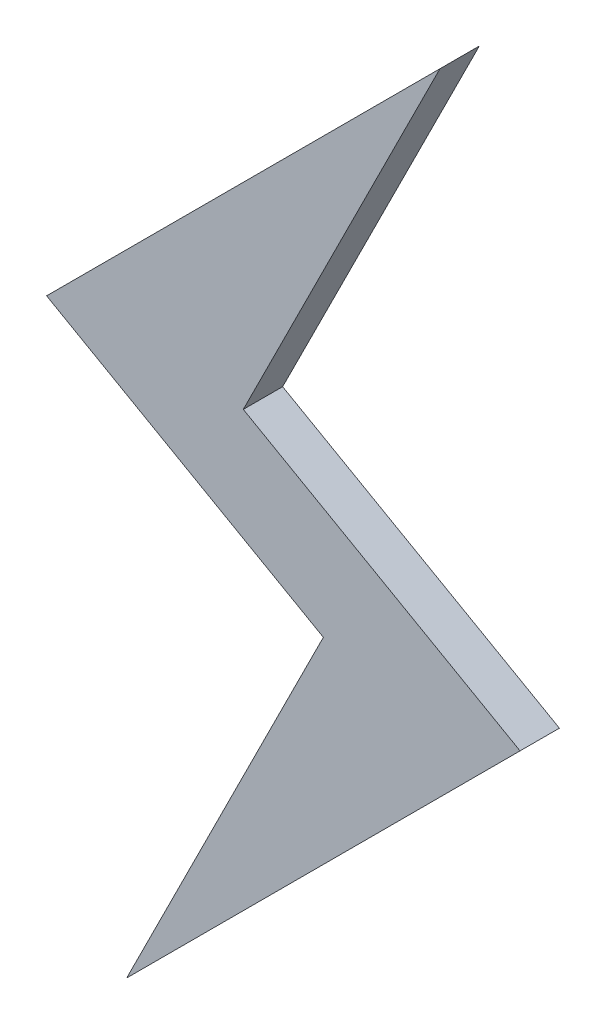
ISO-10303-21;
HEADER;
FILE_DESCRIPTION(('STEP AP214'),'2;1');
FILE_NAME('part.step','',(''),(''),'','','');
FILE_SCHEMA(('AUTOMOTIVE_DESIGN { 1 0 10303 214 1 1 1 1 }'));
ENDSEC;
DATA;
#1=APPLICATION_CONTEXT('core data for automotive mechanical design processes');
#2=APPLICATION_PROTOCOL_DEFINITION('international standard','automotive_design',2000,#1);
#3=PRODUCT_CONTEXT('',#1,'mechanical');
#4=PRODUCT('Part','Part','',(#3));
#5=PRODUCT_RELATED_PRODUCT_CATEGORY('part','',(#4));
#6=PRODUCT_DEFINITION_FORMATION('','',#4);
#7=PRODUCT_DEFINITION_CONTEXT('part definition',#1,'design');
#8=PRODUCT_DEFINITION('design','',#6,#7);
#9=PRODUCT_DEFINITION_SHAPE('','',#8);
#10=(LENGTH_UNIT() NAMED_UNIT(*) SI_UNIT(.MILLI.,.METRE.));
#11=(NAMED_UNIT(*) PLANE_ANGLE_UNIT() SI_UNIT($,.RADIAN.));
#12=(NAMED_UNIT(*) SI_UNIT($,.STERADIAN.) SOLID_ANGLE_UNIT());
#13=UNCERTAINTY_MEASURE_WITH_UNIT(LENGTH_MEASURE(1.E-05),#10,'distance_accuracy_value','');
#14=(GEOMETRIC_REPRESENTATION_CONTEXT(3) GLOBAL_UNCERTAINTY_ASSIGNED_CONTEXT((#13)) GLOBAL_UNIT_ASSIGNED_CONTEXT((#10,
#11,#12)) REPRESENTATION_CONTEXT('',''));
#15=CARTESIAN_POINT('',(0.,0.,0.));
#16=DIRECTION('',(0.,0.,1.));
#17=DIRECTION('',(1.,0.,0.));
#18=AXIS2_PLACEMENT_3D('',#15,#16,#17);
#19=CARTESIAN_POINT('',(35.1771555294527,-20.,5.));
#20=DIRECTION('',(0.494251872086788,0.869318748756005,0.));
#21=DIRECTION('',(-0.869318748756005,0.494251872086788,0.));
#22=AXIS2_PLACEMENT_3D('',#19,#20,#21);
#23=PLANE('',#22);
#24=DIRECTION('',(0.869318748756005,-0.494251872086788,0.));
#25=VECTOR('',#24,1.);
#26=CARTESIAN_POINT('',(35.1771555294527,-20.,0.));
#27=LINE('',#26,#25);
#28=CARTESIAN_POINT('',(0.,0.,0.));
#29=VERTEX_POINT('',#28);
#30=CARTESIAN_POINT('',(35.1771555294527,-20.,0.));
#31=VERTEX_POINT('',#30);
#32=EDGE_CURVE('E128',#29,#31,#27,.T.);
#33=ORIENTED_EDGE('',*,*,#32,.T.);
#34=DIRECTION('',(0.,0.,-1.));
#35=VECTOR('',#34,1.);
#36=CARTESIAN_POINT('',(35.1771555294527,-20.,5.));
#37=LINE('',#36,#35);
#38=CARTESIAN_POINT('',(35.1771555294527,-20.,5.));
#39=VERTEX_POINT('',#38);
#40=EDGE_CURVE('E11',#39,#31,#37,.T.);
#41=ORIENTED_EDGE('',*,*,#40,.F.);
#42=DIRECTION('',(0.869318748756005,-0.494251872086788,0.));
#43=VECTOR('',#42,1.);
#44=CARTESIAN_POINT('',(35.1771555294527,-20.,5.));
#45=LINE('',#44,#43);
#46=CARTESIAN_POINT('',(0.,0.,5.));
#47=VERTEX_POINT('',#46);
#48=EDGE_CURVE('E144',#47,#39,#45,.T.);
#49=ORIENTED_EDGE('',*,*,#48,.F.);
#50=DIRECTION('',(0.,0.,-1.));
#51=VECTOR('',#50,1.);
#52=CARTESIAN_POINT('',(0.,0.,5.));
#53=LINE('',#52,#51);
#54=EDGE_CURVE('E124',#47,#29,#53,.T.);
#55=ORIENTED_EDGE('',*,*,#54,.T.);
#56=EDGE_LOOP('',(#33,#41,#49,#55));
#57=FACE_BOUND('',#56,.T.);
#58=ADVANCED_FACE('F39',(#57),#23,.F.);
#59=CARTESIAN_POINT('',(10.1771555294527,-70.,5.));
#60=DIRECTION('',(0.894427190999916,-0.447213595499958,0.));
#61=DIRECTION('',(0.447213595499958,0.894427190999916,0.));
#62=AXIS2_PLACEMENT_3D('',#59,#60,#61);
#63=PLANE('',#62);
#64=DIRECTION('',(-0.447213595499958,-0.894427190999916,0.));
#65=VECTOR('',#64,1.);
#66=CARTESIAN_POINT('',(10.1771555294527,-70.,0.));
#67=LINE('',#66,#65);
#68=CARTESIAN_POINT('',(10.1771555294527,-70.,0.));
#69=VERTEX_POINT('',#68);
#70=EDGE_CURVE('E132',#31,#69,#67,.T.);
#71=ORIENTED_EDGE('',*,*,#70,.T.);
#72=DIRECTION('',(0.,0.,-1.));
#73=VECTOR('',#72,1.);
#74=CARTESIAN_POINT('',(10.1771555294527,-70.,5.));
#75=LINE('',#74,#73);
#76=CARTESIAN_POINT('',(10.1771555294527,-70.,5.));
#77=VERTEX_POINT('',#76);
#78=EDGE_CURVE('E48',#77,#69,#75,.T.);
#79=ORIENTED_EDGE('',*,*,#78,.F.);
#80=DIRECTION('',(-0.447213595499958,-0.894427190999916,0.));
#81=VECTOR('',#80,1.);
#82=CARTESIAN_POINT('',(10.1771555294527,-70.,5.));
#83=LINE('',#82,#81);
#84=EDGE_CURVE('E93',#39,#77,#83,.T.);
#85=ORIENTED_EDGE('',*,*,#84,.F.);
#86=ORIENTED_EDGE('',*,*,#40,.T.);
#87=EDGE_LOOP('',(#71,#79,#85,#86));
#88=FACE_BOUND('',#87,.T.);
#89=ADVANCED_FACE('F172',(#88),#63,.F.);
#90=CARTESIAN_POINT('',(60.1771555294527,-20.,5.));
#91=DIRECTION('',(-0.707106781186548,0.707106781186547,0.));
#92=DIRECTION('',(-0.707106781186547,-0.707106781186548,0.));
#93=AXIS2_PLACEMENT_3D('',#90,#91,#92);
#94=PLANE('',#93);
#95=DIRECTION('',(0.707106781186547,0.707106781186548,0.));
#96=VECTOR('',#95,1.);
#97=CARTESIAN_POINT('',(60.1771555294527,-20.,0.));
#98=LINE('',#97,#96);
#99=CARTESIAN_POINT('',(60.1771555294527,-20.,0.));
#100=VERTEX_POINT('',#99);
#101=EDGE_CURVE('E135',#69,#100,#98,.T.);
#102=ORIENTED_EDGE('',*,*,#101,.T.);
#103=DIRECTION('',(0.,0.,-1.));
#104=VECTOR('',#103,1.);
#105=CARTESIAN_POINT('',(60.1771555294527,-20.,5.));
#106=LINE('',#105,#104);
#107=CARTESIAN_POINT('',(60.1771555294527,-20.,5.));
#108=VERTEX_POINT('',#107);
#109=EDGE_CURVE('E117',#108,#100,#106,.T.);
#110=ORIENTED_EDGE('',*,*,#109,.F.);
#111=DIRECTION('',(0.707106781186547,0.707106781186548,0.));
#112=VECTOR('',#111,1.);
#113=CARTESIAN_POINT('',(60.1771555294527,-20.,5.));
#114=LINE('',#113,#112);
#115=EDGE_CURVE('E106',#77,#108,#114,.T.);
#116=ORIENTED_EDGE('',*,*,#115,.F.);
#117=ORIENTED_EDGE('',*,*,#78,.T.);
#118=EDGE_LOOP('',(#102,#110,#116,#117));
#119=FACE_BOUND('',#118,.T.);
#120=ADVANCED_FACE('F154',(#119),#94,.F.);
#121=CARTESIAN_POINT('',(25.,0.,5.));
#122=DIRECTION('',(-0.494251872086788,-0.869318748756005,0.));
#123=DIRECTION('',(0.869318748756005,-0.494251872086788,0.));
#124=AXIS2_PLACEMENT_3D('',#121,#122,#123);
#125=PLANE('',#124);
#126=DIRECTION('',(-0.869318748756005,0.494251872086788,0.));
#127=VECTOR('',#126,1.);
#128=CARTESIAN_POINT('',(25.,0.,0.));
#129=LINE('',#128,#127);
#130=CARTESIAN_POINT('',(25.,0.,0.));
#131=VERTEX_POINT('',#130);
#132=EDGE_CURVE('E115',#100,#131,#129,.T.);
#133=ORIENTED_EDGE('',*,*,#132,.T.);
#134=DIRECTION('',(0.,0.,-1.));
#135=VECTOR('',#134,1.);
#136=CARTESIAN_POINT('',(25.,0.,5.));
#137=LINE('',#136,#135);
#138=CARTESIAN_POINT('',(25.,0.,5.));
#139=VERTEX_POINT('',#138);
#140=EDGE_CURVE('E112',#139,#131,#137,.T.);
#141=ORIENTED_EDGE('',*,*,#140,.F.);
#142=DIRECTION('',(-0.869318748756005,0.494251872086788,0.));
#143=VECTOR('',#142,1.);
#144=CARTESIAN_POINT('',(25.,0.,5.));
#145=LINE('',#144,#143);
#146=EDGE_CURVE('E100',#108,#139,#145,.T.);
#147=ORIENTED_EDGE('',*,*,#146,.F.);
#148=ORIENTED_EDGE('',*,*,#109,.T.);
#149=EDGE_LOOP('',(#133,#141,#147,#148));
#150=FACE_BOUND('',#149,.T.);
#151=ADVANCED_FACE('F113',(#150),#125,.F.);
#152=CARTESIAN_POINT('',(50.,50.,5.));
#153=DIRECTION('',(-0.894427190999916,0.447213595499958,0.));
#154=DIRECTION('',(-0.447213595499958,-0.894427190999916,0.));
#155=AXIS2_PLACEMENT_3D('',#152,#153,#154);
#156=PLANE('',#155);
#157=DIRECTION('',(0.447213595499958,0.894427190999916,0.));
#158=VECTOR('',#157,1.);
#159=CARTESIAN_POINT('',(50.,50.,0.));
#160=LINE('',#159,#158);
#161=CARTESIAN_POINT('',(50.,50.,0.));
#162=VERTEX_POINT('',#161);
#163=EDGE_CURVE('E79',#131,#162,#160,.T.);
#164=ORIENTED_EDGE('',*,*,#163,.T.);
#165=DIRECTION('',(0.,0.,-1.));
#166=VECTOR('',#165,1.);
#167=CARTESIAN_POINT('',(50.,50.,5.));
#168=LINE('',#167,#166);
#169=CARTESIAN_POINT('',(50.,50.,5.));
#170=VERTEX_POINT('',#169);
#171=EDGE_CURVE('E118',#170,#162,#168,.T.);
#172=ORIENTED_EDGE('',*,*,#171,.F.);
#173=DIRECTION('',(0.447213595499958,0.894427190999916,0.));
#174=VECTOR('',#173,1.);
#175=CARTESIAN_POINT('',(50.,50.,5.));
#176=LINE('',#175,#174);
#177=EDGE_CURVE('E104',#139,#170,#176,.T.);
#178=ORIENTED_EDGE('',*,*,#177,.F.);
#179=ORIENTED_EDGE('',*,*,#140,.T.);
#180=EDGE_LOOP('',(#164,#172,#178,#179));
#181=FACE_BOUND('',#180,.T.);
#182=ADVANCED_FACE('F120',(#181),#156,.F.);
#183=CARTESIAN_POINT('',(0.,0.,5.));
#184=DIRECTION('',(0.707106781186548,-0.707106781186547,0.));
#185=DIRECTION('',(0.707106781186547,0.707106781186548,0.));
#186=AXIS2_PLACEMENT_3D('',#183,#184,#185);
#187=PLANE('',#186);
#188=DIRECTION('',(-0.707106781186547,-0.707106781186548,0.));
#189=VECTOR('',#188,1.);
#190=CARTESIAN_POINT('',(0.,0.,0.));
#191=LINE('',#190,#189);
#192=EDGE_CURVE('E85',#162,#29,#191,.T.);
#193=ORIENTED_EDGE('',*,*,#192,.T.);
#194=ORIENTED_EDGE('',*,*,#54,.F.);
#195=DIRECTION('',(-0.707106781186547,-0.707106781186548,0.));
#196=VECTOR('',#195,1.);
#197=CARTESIAN_POINT('',(0.,0.,5.));
#198=LINE('',#197,#196);
#199=EDGE_CURVE('E56',#170,#47,#198,.T.);
#200=ORIENTED_EDGE('',*,*,#199,.F.);
#201=ORIENTED_EDGE('',*,*,#171,.T.);
#202=EDGE_LOOP('',(#193,#194,#200,#201));
#203=FACE_BOUND('',#202,.T.);
#204=ADVANCED_FACE('F161',(#203),#187,.F.);
#205=CARTESIAN_POINT('',(0.,0.,5.));
#206=DIRECTION('',(0.,0.,1.));
#207=DIRECTION('',(1.,0.,0.));
#208=AXIS2_PLACEMENT_3D('',#205,#206,#207);
#209=PLANE('',#208);
#210=ORIENTED_EDGE('',*,*,#48,.T.);
#211=ORIENTED_EDGE('',*,*,#84,.T.);
#212=ORIENTED_EDGE('',*,*,#115,.T.);
#213=ORIENTED_EDGE('',*,*,#146,.T.);
#214=ORIENTED_EDGE('',*,*,#177,.T.);
#215=ORIENTED_EDGE('',*,*,#199,.T.);
#216=EDGE_LOOP('',(#210,#211,#212,#213,#214,#215));
#217=FACE_BOUND('',#216,.T.);
#218=ADVANCED_FACE('F102',(#217),#209,.T.);
#219=CARTESIAN_POINT('',(0.,0.,0.));
#220=DIRECTION('',(0.,0.,1.));
#221=DIRECTION('',(1.,0.,0.));
#222=AXIS2_PLACEMENT_3D('',#219,#220,#221);
#223=PLANE('',#222);
#224=ORIENTED_EDGE('',*,*,#32,.F.);
#225=ORIENTED_EDGE('',*,*,#192,.F.);
#226=ORIENTED_EDGE('',*,*,#163,.F.);
#227=ORIENTED_EDGE('',*,*,#132,.F.);
#228=ORIENTED_EDGE('',*,*,#101,.F.);
#229=ORIENTED_EDGE('',*,*,#70,.F.);
#230=EDGE_LOOP('',(#224,#225,#226,#227,#228,#229));
#231=FACE_BOUND('',#230,.T.);
#232=ADVANCED_FACE('F157',(#231),#223,.F.);
#233=CLOSED_SHELL('',(#58,#89,#120,#151,#182,#204,#218,#232));
#234=MANIFOLD_SOLID_BREP('B2',#233);
#235=ADVANCED_BREP_SHAPE_REPRESENTATION('',(#18,#234),#14);
#236=SHAPE_DEFINITION_REPRESENTATION(#9,#235);
ENDSEC;
END-ISO-10303-21;
